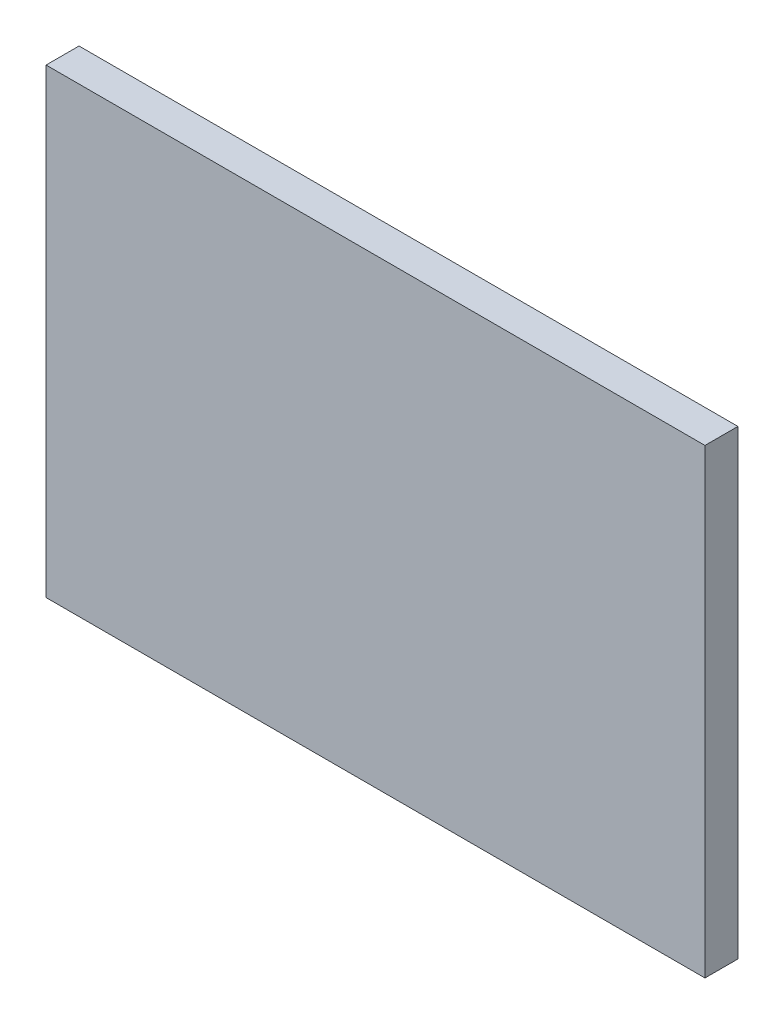
ISO-10303-21;
HEADER;
FILE_DESCRIPTION(('STEP AP214'),'2;1');
FILE_NAME('part.step','',(''),(''),'','','');
FILE_SCHEMA(('AUTOMOTIVE_DESIGN { 1 0 10303 214 1 1 1 1 }'));
ENDSEC;
DATA;
#1=APPLICATION_CONTEXT('core data for automotive mechanical design processes');
#2=APPLICATION_PROTOCOL_DEFINITION('international standard','automotive_design',2000,#1);
#3=PRODUCT_CONTEXT('',#1,'mechanical');
#4=PRODUCT('Part','Part','',(#3));
#5=PRODUCT_RELATED_PRODUCT_CATEGORY('part','',(#4));
#6=PRODUCT_DEFINITION_FORMATION('','',#4);
#7=PRODUCT_DEFINITION_CONTEXT('part definition',#1,'design');
#8=PRODUCT_DEFINITION('design','',#6,#7);
#9=PRODUCT_DEFINITION_SHAPE('','',#8);
#10=(LENGTH_UNIT() NAMED_UNIT(*) SI_UNIT(.MILLI.,.METRE.));
#11=(NAMED_UNIT(*) PLANE_ANGLE_UNIT() SI_UNIT($,.RADIAN.));
#12=(NAMED_UNIT(*) SI_UNIT($,.STERADIAN.) SOLID_ANGLE_UNIT());
#13=UNCERTAINTY_MEASURE_WITH_UNIT(LENGTH_MEASURE(1.E-05),#10,'distance_accuracy_value','');
#14=(GEOMETRIC_REPRESENTATION_CONTEXT(3) GLOBAL_UNCERTAINTY_ASSIGNED_CONTEXT((#13)) GLOBAL_UNIT_ASSIGNED_CONTEXT((#10,
#11,#12)) REPRESENTATION_CONTEXT('',''));
#15=CARTESIAN_POINT('',(0.,0.,0.));
#16=DIRECTION('',(0.,0.,1.));
#17=DIRECTION('',(1.,0.,0.));
#18=AXIS2_PLACEMENT_3D('',#15,#16,#17);
#19=CARTESIAN_POINT('',(20.,14.,2.));
#20=DIRECTION('',(-1.,0.,0.));
#21=DIRECTION('',(0.,-1.,0.));
#22=AXIS2_PLACEMENT_3D('',#19,#20,#21);
#23=PLANE('',#22);
#24=DIRECTION('',(0.,1.,0.));
#25=VECTOR('',#24,1.);
#26=CARTESIAN_POINT('',(20.,14.,0.));
#27=LINE('',#26,#25);
#28=CARTESIAN_POINT('',(20.,-14.,0.));
#29=VERTEX_POINT('',#28);
#30=CARTESIAN_POINT('',(20.,14.,0.));
#31=VERTEX_POINT('',#30);
#32=EDGE_CURVE('E96',#29,#31,#27,.T.);
#33=ORIENTED_EDGE('',*,*,#32,.T.);
#34=DIRECTION('',(0.,0.,-1.));
#35=VECTOR('',#34,1.);
#36=CARTESIAN_POINT('',(20.,14.,2.));
#37=LINE('',#36,#35);
#38=CARTESIAN_POINT('',(20.,14.,2.));
#39=VERTEX_POINT('',#38);
#40=EDGE_CURVE('E11',#39,#31,#37,.T.);
#41=ORIENTED_EDGE('',*,*,#40,.F.);
#42=DIRECTION('',(0.,1.,0.));
#43=VECTOR('',#42,1.);
#44=CARTESIAN_POINT('',(20.,14.,2.));
#45=LINE('',#44,#43);
#46=CARTESIAN_POINT('',(20.,-14.,2.));
#47=VERTEX_POINT('',#46);
#48=EDGE_CURVE('E84',#47,#39,#45,.T.);
#49=ORIENTED_EDGE('',*,*,#48,.F.);
#50=DIRECTION('',(0.,0.,-1.));
#51=VECTOR('',#50,1.);
#52=CARTESIAN_POINT('',(20.,-14.,2.));
#53=LINE('',#52,#51);
#54=EDGE_CURVE('E92',#47,#29,#53,.T.);
#55=ORIENTED_EDGE('',*,*,#54,.T.);
#56=EDGE_LOOP('',(#33,#41,#49,#55));
#57=FACE_BOUND('',#56,.T.);
#58=ADVANCED_FACE('F33',(#57),#23,.F.);
#59=CARTESIAN_POINT('',(-20.,14.,2.));
#60=DIRECTION('',(0.,-1.,0.));
#61=DIRECTION('',(0.,0.,-1.));
#62=AXIS2_PLACEMENT_3D('',#59,#60,#61);
#63=PLANE('',#62);
#64=DIRECTION('',(-1.,0.,0.));
#65=VECTOR('',#64,1.);
#66=CARTESIAN_POINT('',(-20.,14.,0.));
#67=LINE('',#66,#65);
#68=CARTESIAN_POINT('',(-20.,14.,0.));
#69=VERTEX_POINT('',#68);
#70=EDGE_CURVE('E88',#31,#69,#67,.T.);
#71=ORIENTED_EDGE('',*,*,#70,.T.);
#72=DIRECTION('',(0.,0.,-1.));
#73=VECTOR('',#72,1.);
#74=CARTESIAN_POINT('',(-20.,14.,2.));
#75=LINE('',#74,#73);
#76=CARTESIAN_POINT('',(-20.,14.,2.));
#77=VERTEX_POINT('',#76);
#78=EDGE_CURVE('E41',#77,#69,#75,.T.);
#79=ORIENTED_EDGE('',*,*,#78,.F.);
#80=DIRECTION('',(-1.,0.,0.));
#81=VECTOR('',#80,1.);
#82=CARTESIAN_POINT('',(-20.,14.,2.));
#83=LINE('',#82,#81);
#84=EDGE_CURVE('E79',#39,#77,#83,.T.);
#85=ORIENTED_EDGE('',*,*,#84,.F.);
#86=ORIENTED_EDGE('',*,*,#40,.T.);
#87=EDGE_LOOP('',(#71,#79,#85,#86));
#88=FACE_BOUND('',#87,.T.);
#89=ADVANCED_FACE('F87',(#88),#63,.F.);
#90=CARTESIAN_POINT('',(-20.,14.,2.));
#91=DIRECTION('',(1.,0.,0.));
#92=DIRECTION('',(0.,1.,0.));
#93=AXIS2_PLACEMENT_3D('',#90,#91,#92);
#94=PLANE('',#93);
#95=DIRECTION('',(0.,-1.,0.));
#96=VECTOR('',#95,1.);
#97=CARTESIAN_POINT('',(-20.,14.,0.));
#98=LINE('',#97,#96);
#99=CARTESIAN_POINT('',(-20.,-14.,0.));
#100=VERTEX_POINT('',#99);
#101=EDGE_CURVE('E66',#69,#100,#98,.T.);
#102=ORIENTED_EDGE('',*,*,#101,.T.);
#103=DIRECTION('',(0.,0.,-1.));
#104=VECTOR('',#103,1.);
#105=CARTESIAN_POINT('',(-20.,-14.,2.));
#106=LINE('',#105,#104);
#107=CARTESIAN_POINT('',(-20.,-14.,2.));
#108=VERTEX_POINT('',#107);
#109=EDGE_CURVE('E89',#108,#100,#106,.T.);
#110=ORIENTED_EDGE('',*,*,#109,.F.);
#111=DIRECTION('',(0.,-1.,0.));
#112=VECTOR('',#111,1.);
#113=CARTESIAN_POINT('',(-20.,14.,2.));
#114=LINE('',#113,#112);
#115=EDGE_CURVE('E82',#77,#108,#114,.T.);
#116=ORIENTED_EDGE('',*,*,#115,.F.);
#117=ORIENTED_EDGE('',*,*,#78,.T.);
#118=EDGE_LOOP('',(#102,#110,#116,#117));
#119=FACE_BOUND('',#118,.T.);
#120=ADVANCED_FACE('F90',(#119),#94,.F.);
#121=CARTESIAN_POINT('',(-20.,-14.,2.));
#122=DIRECTION('',(0.,1.,0.));
#123=DIRECTION('',(0.,0.,1.));
#124=AXIS2_PLACEMENT_3D('',#121,#122,#123);
#125=PLANE('',#124);
#126=DIRECTION('',(1.,0.,0.));
#127=VECTOR('',#126,1.);
#128=CARTESIAN_POINT('',(-20.,-14.,0.));
#129=LINE('',#128,#127);
#130=EDGE_CURVE('E72',#100,#29,#129,.T.);
#131=ORIENTED_EDGE('',*,*,#130,.T.);
#132=ORIENTED_EDGE('',*,*,#54,.F.);
#133=DIRECTION('',(1.,0.,0.));
#134=VECTOR('',#133,1.);
#135=CARTESIAN_POINT('',(-20.,-14.,2.));
#136=LINE('',#135,#134);
#137=EDGE_CURVE('E49',#108,#47,#136,.T.);
#138=ORIENTED_EDGE('',*,*,#137,.F.);
#139=ORIENTED_EDGE('',*,*,#109,.T.);
#140=EDGE_LOOP('',(#131,#132,#138,#139));
#141=FACE_BOUND('',#140,.T.);
#142=ADVANCED_FACE('F103',(#141),#125,.F.);
#143=CARTESIAN_POINT('',(0.,0.,2.));
#144=DIRECTION('',(0.,0.,1.));
#145=DIRECTION('',(1.,0.,0.));
#146=AXIS2_PLACEMENT_3D('',#143,#144,#145);
#147=PLANE('',#146);
#148=ORIENTED_EDGE('',*,*,#48,.T.);
#149=ORIENTED_EDGE('',*,*,#84,.T.);
#150=ORIENTED_EDGE('',*,*,#115,.T.);
#151=ORIENTED_EDGE('',*,*,#137,.T.);
#152=EDGE_LOOP('',(#148,#149,#150,#151));
#153=FACE_BOUND('',#152,.T.);
#154=ADVANCED_FACE('F80',(#153),#147,.T.);
#155=CARTESIAN_POINT('',(0.,0.,0.));
#156=DIRECTION('',(0.,0.,1.));
#157=DIRECTION('',(1.,0.,0.));
#158=AXIS2_PLACEMENT_3D('',#155,#156,#157);
#159=PLANE('',#158);
#160=ORIENTED_EDGE('',*,*,#32,.F.);
#161=ORIENTED_EDGE('',*,*,#130,.F.);
#162=ORIENTED_EDGE('',*,*,#101,.F.);
#163=ORIENTED_EDGE('',*,*,#70,.F.);
#164=EDGE_LOOP('',(#160,#161,#162,#163));
#165=FACE_BOUND('',#164,.T.);
#166=ADVANCED_FACE('F106',(#165),#159,.F.);
#167=CLOSED_SHELL('',(#58,#89,#120,#142,#154,#166));
#168=MANIFOLD_SOLID_BREP('B2',#167);
#169=ADVANCED_BREP_SHAPE_REPRESENTATION('',(#18,#168),#14);
#170=SHAPE_DEFINITION_REPRESENTATION(#9,#169);
ENDSEC;
END-ISO-10303-21;
